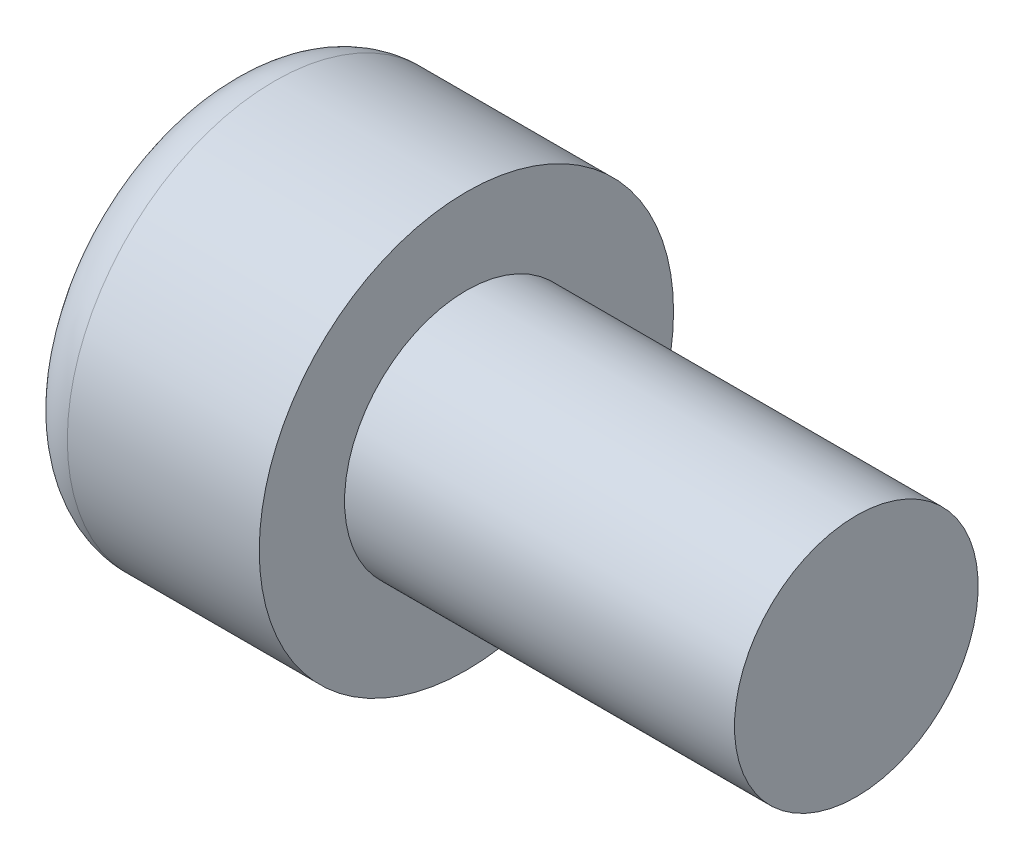
ISO-10303-21;
HEADER;
FILE_DESCRIPTION(('STEP AP214'),'2;1');
FILE_NAME('part.step','',(''),(''),'','','');
FILE_SCHEMA(('AUTOMOTIVE_DESIGN { 1 0 10303 214 1 1 1 1 }'));
ENDSEC;
DATA;
#1=APPLICATION_CONTEXT('core data for automotive mechanical design processes');
#2=APPLICATION_PROTOCOL_DEFINITION('international standard','automotive_design',2000,#1);
#3=PRODUCT_CONTEXT('',#1,'mechanical');
#4=PRODUCT('Part','Part','',(#3));
#5=PRODUCT_RELATED_PRODUCT_CATEGORY('part','',(#4));
#6=PRODUCT_DEFINITION_FORMATION('','',#4);
#7=PRODUCT_DEFINITION_CONTEXT('part definition',#1,'design');
#8=PRODUCT_DEFINITION('design','',#6,#7);
#9=PRODUCT_DEFINITION_SHAPE('','',#8);
#10=(LENGTH_UNIT() NAMED_UNIT(*) SI_UNIT(.MILLI.,.METRE.));
#11=(NAMED_UNIT(*) PLANE_ANGLE_UNIT() SI_UNIT($,.RADIAN.));
#12=(NAMED_UNIT(*) SI_UNIT($,.STERADIAN.) SOLID_ANGLE_UNIT());
#13=UNCERTAINTY_MEASURE_WITH_UNIT(LENGTH_MEASURE(1.E-05),#10,'distance_accuracy_value','');
#14=(GEOMETRIC_REPRESENTATION_CONTEXT(3) GLOBAL_UNCERTAINTY_ASSIGNED_CONTEXT((#13)) GLOBAL_UNIT_ASSIGNED_CONTEXT((#10,
#11,#12)) REPRESENTATION_CONTEXT('',''));
#15=CARTESIAN_POINT('',(0.,0.,0.));
#16=DIRECTION('',(0.,0.,1.));
#17=DIRECTION('',(1.,0.,0.));
#18=AXIS2_PLACEMENT_3D('',#15,#16,#17);
#19=CARTESIAN_POINT('',(0.,0.,0.));
#20=DIRECTION('',(1.,0.,0.));
#21=DIRECTION('',(0.,1.,0.));
#22=AXIS2_PLACEMENT_3D('',#19,#20,#21);
#23=PLANE('',#22);
#24=DIRECTION('',(0.,-0.5,-0.866025403784439));
#25=VECTOR('',#24,1.);
#26=CARTESIAN_POINT('',(0.,2.3094010767585,0.));
#27=LINE('',#26,#25);
#28=CARTESIAN_POINT('',(0.,2.3094010767585,0.));
#29=VERTEX_POINT('',#28);
#30=CARTESIAN_POINT('',(0.,1.15470053837925,-2.));
#31=VERTEX_POINT('',#30);
#32=EDGE_CURVE('E121',#29,#31,#27,.T.);
#33=ORIENTED_EDGE('',*,*,#32,.F.);
#34=DIRECTION('',(0.,0.5,-0.866025403784439));
#35=VECTOR('',#34,1.);
#36=CARTESIAN_POINT('',(0.,1.15470053837925,2.));
#37=LINE('',#36,#35);
#38=CARTESIAN_POINT('',(0.,1.15470053837925,2.));
#39=VERTEX_POINT('',#38);
#40=EDGE_CURVE('E47',#39,#29,#37,.T.);
#41=ORIENTED_EDGE('',*,*,#40,.F.);
#42=DIRECTION('',(0.,1.,0.));
#43=VECTOR('',#42,1.);
#44=CARTESIAN_POINT('',(0.,-1.15470053837925,2.));
#45=LINE('',#44,#43);
#46=CARTESIAN_POINT('',(0.,-1.15470053837925,2.));
#47=VERTEX_POINT('',#46);
#48=EDGE_CURVE('E130',#47,#39,#45,.T.);
#49=ORIENTED_EDGE('',*,*,#48,.F.);
#50=DIRECTION('',(0.,0.5,0.866025403784439));
#51=VECTOR('',#50,1.);
#52=CARTESIAN_POINT('',(0.,-2.3094010767585,0.));
#53=LINE('',#52,#51);
#54=CARTESIAN_POINT('',(0.,-2.3094010767585,0.));
#55=VERTEX_POINT('',#54);
#56=EDGE_CURVE('E128',#55,#47,#53,.T.);
#57=ORIENTED_EDGE('',*,*,#56,.F.);
#58=DIRECTION('',(0.,-0.5,0.866025403784439));
#59=VECTOR('',#58,1.);
#60=CARTESIAN_POINT('',(0.,-1.15470053837925,-2.));
#61=LINE('',#60,#59);
#62=CARTESIAN_POINT('',(0.,-1.15470053837925,-2.));
#63=VERTEX_POINT('',#62);
#64=EDGE_CURVE('E95',#63,#55,#61,.T.);
#65=ORIENTED_EDGE('',*,*,#64,.F.);
#66=DIRECTION('',(0.,-1.,0.));
#67=VECTOR('',#66,1.);
#68=CARTESIAN_POINT('',(0.,1.15470053837925,-2.));
#69=LINE('',#68,#67);
#70=EDGE_CURVE('E124',#31,#63,#69,.T.);
#71=ORIENTED_EDGE('',*,*,#70,.F.);
#72=EDGE_LOOP('',(#33,#41,#49,#57,#65,#71));
#73=FACE_BOUND('',#72,.T.);
#74=CARTESIAN_POINT('',(0.,0.,0.));
#75=DIRECTION('',(-1.,0.,0.));
#76=DIRECTION('',(0.,-1.,0.));
#77=AXIS2_PLACEMENT_3D('',#74,#75,#76);
#78=CIRCLE('',#77,3.1875);
#79=CARTESIAN_POINT('',(0.,-3.1875,0.));
#80=VERTEX_POINT('',#79);
#81=EDGE_CURVE('E11',#80,#80,#78,.T.);
#82=ORIENTED_EDGE('',*,*,#81,.T.);
#83=EDGE_LOOP('',(#82));
#84=FACE_BOUND('',#83,.T.);
#85=ADVANCED_FACE('F33',(#73,#84),#23,.F.);
#86=CARTESIAN_POINT('',(1.0625,0.,0.));
#87=DIRECTION('',(-1.,0.,0.));
#88=DIRECTION('',(0.,-1.,0.));
#89=AXIS2_PLACEMENT_3D('',#86,#87,#88);
#90=TOROIDAL_SURFACE('',#89,3.1875,1.0625);
#91=ORIENTED_EDGE('',*,*,#81,.F.);
#92=EDGE_LOOP('',(#91));
#93=FACE_BOUND('',#92,.T.);
#94=CARTESIAN_POINT('',(1.0625,0.,0.));
#95=DIRECTION('',(-1.,0.,0.));
#96=DIRECTION('',(0.,-1.,0.));
#97=AXIS2_PLACEMENT_3D('',#94,#95,#96);
#98=CIRCLE('',#97,4.25);
#99=CARTESIAN_POINT('',(1.0625,-4.25,0.));
#100=VERTEX_POINT('',#99);
#101=EDGE_CURVE('E40',#100,#100,#98,.T.);
#102=ORIENTED_EDGE('',*,*,#101,.T.);
#103=EDGE_LOOP('',(#102));
#104=FACE_BOUND('',#103,.T.);
#105=ADVANCED_FACE('F150',(#93,#104),#90,.T.);
#106=CARTESIAN_POINT('',(0.,0.,0.));
#107=DIRECTION('',(-1.,0.,0.));
#108=DIRECTION('',(0.,-1.,0.));
#109=AXIS2_PLACEMENT_3D('',#106,#107,#108);
#110=CYLINDRICAL_SURFACE('',#109,4.25);
#111=ORIENTED_EDGE('',*,*,#101,.F.);
#112=EDGE_LOOP('',(#111));
#113=FACE_BOUND('',#112,.T.);
#114=CARTESIAN_POINT('',(5.,0.,0.));
#115=DIRECTION('',(-1.,0.,0.));
#116=DIRECTION('',(0.,-1.,0.));
#117=AXIS2_PLACEMENT_3D('',#114,#115,#116);
#118=CIRCLE('',#117,4.25);
#119=CARTESIAN_POINT('',(5.,-4.25,0.));
#120=VERTEX_POINT('',#119);
#121=EDGE_CURVE('E145',#120,#120,#118,.T.);
#122=ORIENTED_EDGE('',*,*,#121,.T.);
#123=EDGE_LOOP('',(#122));
#124=FACE_BOUND('',#123,.T.);
#125=ADVANCED_FACE('F152',(#113,#124),#110,.T.);
#126=CARTESIAN_POINT('',(5.,4.25,0.));
#127=DIRECTION('',(-1.,0.,0.));
#128=DIRECTION('',(0.,-1.,0.));
#129=AXIS2_PLACEMENT_3D('',#126,#127,#128);
#130=PLANE('',#129);
#131=ORIENTED_EDGE('',*,*,#121,.F.);
#132=EDGE_LOOP('',(#131));
#133=FACE_BOUND('',#132,.T.);
#134=CARTESIAN_POINT('',(5.,0.,0.));
#135=DIRECTION('',(-1.,0.,0.));
#136=DIRECTION('',(0.,-1.,0.));
#137=AXIS2_PLACEMENT_3D('',#134,#135,#136);
#138=CIRCLE('',#137,2.5);
#139=CARTESIAN_POINT('',(5.,-2.5,0.));
#140=VERTEX_POINT('',#139);
#141=EDGE_CURVE('E142',#140,#140,#138,.T.);
#142=ORIENTED_EDGE('',*,*,#141,.T.);
#143=EDGE_LOOP('',(#142));
#144=FACE_BOUND('',#143,.T.);
#145=ADVANCED_FACE('F155',(#133,#144),#130,.F.);
#146=CARTESIAN_POINT('',(0.,0.,0.));
#147=DIRECTION('',(-1.,0.,0.));
#148=DIRECTION('',(0.,-1.,0.));
#149=AXIS2_PLACEMENT_3D('',#146,#147,#148);
#150=CYLINDRICAL_SURFACE('',#149,2.5);
#151=ORIENTED_EDGE('',*,*,#141,.F.);
#152=EDGE_LOOP('',(#151));
#153=FACE_BOUND('',#152,.T.);
#154=CARTESIAN_POINT('',(13.,0.,0.));
#155=DIRECTION('',(-1.,0.,0.));
#156=DIRECTION('',(0.,-1.,0.));
#157=AXIS2_PLACEMENT_3D('',#154,#155,#156);
#158=CIRCLE('',#157,2.5);
#159=CARTESIAN_POINT('',(13.,-2.5,0.));
#160=VERTEX_POINT('',#159);
#161=EDGE_CURVE('E134',#160,#160,#158,.T.);
#162=ORIENTED_EDGE('',*,*,#161,.T.);
#163=EDGE_LOOP('',(#162));
#164=FACE_BOUND('',#163,.T.);
#165=ADVANCED_FACE('F161',(#153,#164),#150,.T.);
#166=CARTESIAN_POINT('',(13.,2.5,0.));
#167=DIRECTION('',(-1.,0.,0.));
#168=DIRECTION('',(0.,-1.,0.));
#169=AXIS2_PLACEMENT_3D('',#166,#167,#168);
#170=PLANE('',#169);
#171=ORIENTED_EDGE('',*,*,#161,.F.);
#172=EDGE_LOOP('',(#171));
#173=FACE_BOUND('',#172,.T.);
#174=ADVANCED_FACE('F167',(#173),#170,.F.);
#175=CARTESIAN_POINT('',(2.5,1.15470053837925,2.));
#176=DIRECTION('',(0.,0.866025403784439,0.5));
#177=DIRECTION('',(0.,-0.5,0.866025403784439));
#178=AXIS2_PLACEMENT_3D('',#175,#176,#177);
#179=PLANE('',#178);
#180=ORIENTED_EDGE('',*,*,#40,.T.);
#181=DIRECTION('',(-1.,0.,0.));
#182=VECTOR('',#181,1.);
#183=CARTESIAN_POINT('',(2.5,2.3094010767585,0.));
#184=LINE('',#183,#182);
#185=CARTESIAN_POINT('',(2.5,2.3094010767585,0.));
#186=VERTEX_POINT('',#185);
#187=EDGE_CURVE('E77',#186,#29,#184,.T.);
#188=ORIENTED_EDGE('',*,*,#187,.F.);
#189=DIRECTION('',(0.,0.5,-0.866025403784439));
#190=VECTOR('',#189,1.);
#191=CARTESIAN_POINT('',(2.5,1.15470053837925,2.));
#192=LINE('',#191,#190);
#193=CARTESIAN_POINT('',(2.5,1.15470053837925,2.));
#194=VERTEX_POINT('',#193);
#195=EDGE_CURVE('E132',#194,#186,#192,.T.);
#196=ORIENTED_EDGE('',*,*,#195,.F.);
#197=DIRECTION('',(-1.,0.,0.));
#198=VECTOR('',#197,1.);
#199=CARTESIAN_POINT('',(2.5,1.15470053837925,2.));
#200=LINE('',#199,#198);
#201=EDGE_CURVE('E55',#194,#39,#200,.T.);
#202=ORIENTED_EDGE('',*,*,#201,.T.);
#203=EDGE_LOOP('',(#180,#188,#196,#202));
#204=FACE_BOUND('',#203,.T.);
#205=ADVANCED_FACE('F172',(#204),#179,.F.);
#206=CARTESIAN_POINT('',(2.5,-1.15470053837925,2.));
#207=DIRECTION('',(0.,0.,1.));
#208=DIRECTION('',(1.,0.,0.));
#209=AXIS2_PLACEMENT_3D('',#206,#207,#208);
#210=PLANE('',#209);
#211=ORIENTED_EDGE('',*,*,#48,.T.);
#212=ORIENTED_EDGE('',*,*,#201,.F.);
#213=DIRECTION('',(0.,1.,0.));
#214=VECTOR('',#213,1.);
#215=CARTESIAN_POINT('',(2.5,-1.15470053837925,2.));
#216=LINE('',#215,#214);
#217=CARTESIAN_POINT('',(2.5,-1.15470053837925,2.));
#218=VERTEX_POINT('',#217);
#219=EDGE_CURVE('E107',#218,#194,#216,.T.);
#220=ORIENTED_EDGE('',*,*,#219,.F.);
#221=DIRECTION('',(-1.,0.,0.));
#222=VECTOR('',#221,1.);
#223=CARTESIAN_POINT('',(2.5,-1.15470053837925,2.));
#224=LINE('',#223,#222);
#225=EDGE_CURVE('E99',#218,#47,#224,.T.);
#226=ORIENTED_EDGE('',*,*,#225,.T.);
#227=EDGE_LOOP('',(#211,#212,#220,#226));
#228=FACE_BOUND('',#227,.T.);
#229=ADVANCED_FACE('F177',(#228),#210,.F.);
#230=CARTESIAN_POINT('',(2.5,-2.3094010767585,0.));
#231=DIRECTION('',(0.,-0.866025403784439,0.5));
#232=DIRECTION('',(0.,-0.5,-0.866025403784439));
#233=AXIS2_PLACEMENT_3D('',#230,#231,#232);
#234=PLANE('',#233);
#235=ORIENTED_EDGE('',*,*,#56,.T.);
#236=ORIENTED_EDGE('',*,*,#225,.F.);
#237=DIRECTION('',(0.,0.5,0.866025403784439));
#238=VECTOR('',#237,1.);
#239=CARTESIAN_POINT('',(2.5,-2.3094010767585,0.));
#240=LINE('',#239,#238);
#241=CARTESIAN_POINT('',(2.5,-2.3094010767585,0.));
#242=VERTEX_POINT('',#241);
#243=EDGE_CURVE('E103',#242,#218,#240,.T.);
#244=ORIENTED_EDGE('',*,*,#243,.F.);
#245=DIRECTION('',(-1.,0.,0.));
#246=VECTOR('',#245,1.);
#247=CARTESIAN_POINT('',(2.5,-2.3094010767585,0.));
#248=LINE('',#247,#246);
#249=EDGE_CURVE('E88',#242,#55,#248,.T.);
#250=ORIENTED_EDGE('',*,*,#249,.T.);
#251=EDGE_LOOP('',(#235,#236,#244,#250));
#252=FACE_BOUND('',#251,.T.);
#253=ADVANCED_FACE('F104',(#252),#234,.F.);
#254=CARTESIAN_POINT('',(2.5,-1.15470053837925,-2.));
#255=DIRECTION('',(0.,-0.866025403784438,-0.5));
#256=DIRECTION('',(0.,0.5,-0.866025403784438));
#257=AXIS2_PLACEMENT_3D('',#254,#255,#256);
#258=PLANE('',#257);
#259=ORIENTED_EDGE('',*,*,#64,.T.);
#260=ORIENTED_EDGE('',*,*,#249,.F.);
#261=DIRECTION('',(0.,-0.5,0.866025403784439));
#262=VECTOR('',#261,1.);
#263=CARTESIAN_POINT('',(2.5,-1.15470053837925,-2.));
#264=LINE('',#263,#262);
#265=CARTESIAN_POINT('',(2.5,-1.15470053837925,-2.));
#266=VERTEX_POINT('',#265);
#267=EDGE_CURVE('E92',#266,#242,#264,.T.);
#268=ORIENTED_EDGE('',*,*,#267,.F.);
#269=DIRECTION('',(-1.,0.,0.));
#270=VECTOR('',#269,1.);
#271=CARTESIAN_POINT('',(2.5,-1.15470053837925,-2.));
#272=LINE('',#271,#270);
#273=EDGE_CURVE('E100',#266,#63,#272,.T.);
#274=ORIENTED_EDGE('',*,*,#273,.T.);
#275=EDGE_LOOP('',(#259,#260,#268,#274));
#276=FACE_BOUND('',#275,.T.);
#277=ADVANCED_FACE('F90',(#276),#258,.F.);
#278=CARTESIAN_POINT('',(2.5,1.15470053837925,-2.));
#279=DIRECTION('',(0.,0.,-1.));
#280=DIRECTION('',(-1.,0.,0.));
#281=AXIS2_PLACEMENT_3D('',#278,#279,#280);
#282=PLANE('',#281);
#283=ORIENTED_EDGE('',*,*,#70,.T.);
#284=ORIENTED_EDGE('',*,*,#273,.F.);
#285=DIRECTION('',(0.,-1.,0.));
#286=VECTOR('',#285,1.);
#287=CARTESIAN_POINT('',(2.5,1.15470053837925,-2.));
#288=LINE('',#287,#286);
#289=CARTESIAN_POINT('',(2.5,1.15470053837925,-2.));
#290=VERTEX_POINT('',#289);
#291=EDGE_CURVE('E113',#290,#266,#288,.T.);
#292=ORIENTED_EDGE('',*,*,#291,.F.);
#293=DIRECTION('',(-1.,0.,0.));
#294=VECTOR('',#293,1.);
#295=CARTESIAN_POINT('',(2.5,1.15470053837925,-2.));
#296=LINE('',#295,#294);
#297=EDGE_CURVE('E137',#290,#31,#296,.T.);
#298=ORIENTED_EDGE('',*,*,#297,.T.);
#299=EDGE_LOOP('',(#283,#284,#292,#298));
#300=FACE_BOUND('',#299,.T.);
#301=ADVANCED_FACE('F203',(#300),#282,.F.);
#302=CARTESIAN_POINT('',(2.5,2.3094010767585,0.));
#303=DIRECTION('',(0.,0.866025403784439,-0.5));
#304=DIRECTION('',(0.,0.5,0.866025403784439));
#305=AXIS2_PLACEMENT_3D('',#302,#303,#304);
#306=PLANE('',#305);
#307=ORIENTED_EDGE('',*,*,#32,.T.);
#308=ORIENTED_EDGE('',*,*,#297,.F.);
#309=DIRECTION('',(0.,-0.5,-0.866025403784439));
#310=VECTOR('',#309,1.);
#311=CARTESIAN_POINT('',(2.5,2.3094010767585,0.));
#312=LINE('',#311,#310);
#313=EDGE_CURVE('E115',#186,#290,#312,.T.);
#314=ORIENTED_EDGE('',*,*,#313,.F.);
#315=ORIENTED_EDGE('',*,*,#187,.T.);
#316=EDGE_LOOP('',(#307,#308,#314,#315));
#317=FACE_BOUND('',#316,.T.);
#318=ADVANCED_FACE('F191',(#317),#306,.F.);
#319=CARTESIAN_POINT('',(2.5,0.,0.));
#320=DIRECTION('',(-1.,0.,0.));
#321=DIRECTION('',(0.,-1.,0.));
#322=AXIS2_PLACEMENT_3D('',#319,#320,#321);
#323=PLANE('',#322);
#324=ORIENTED_EDGE('',*,*,#195,.T.);
#325=ORIENTED_EDGE('',*,*,#313,.T.);
#326=ORIENTED_EDGE('',*,*,#291,.T.);
#327=ORIENTED_EDGE('',*,*,#267,.T.);
#328=ORIENTED_EDGE('',*,*,#243,.T.);
#329=ORIENTED_EDGE('',*,*,#219,.T.);
#330=EDGE_LOOP('',(#324,#325,#326,#327,#328,#329));
#331=FACE_BOUND('',#330,.T.);
#332=ADVANCED_FACE('F110',(#331),#323,.T.);
#333=CLOSED_SHELL('',(#85,#105,#125,#145,#165,#174,#205,#229,#253,#277,#301,#318,#332));
#334=MANIFOLD_SOLID_BREP('B2',#333);
#335=ADVANCED_BREP_SHAPE_REPRESENTATION('',(#18,#334),#14);
#336=SHAPE_DEFINITION_REPRESENTATION(#9,#335);
ENDSEC;
END-ISO-10303-21;
